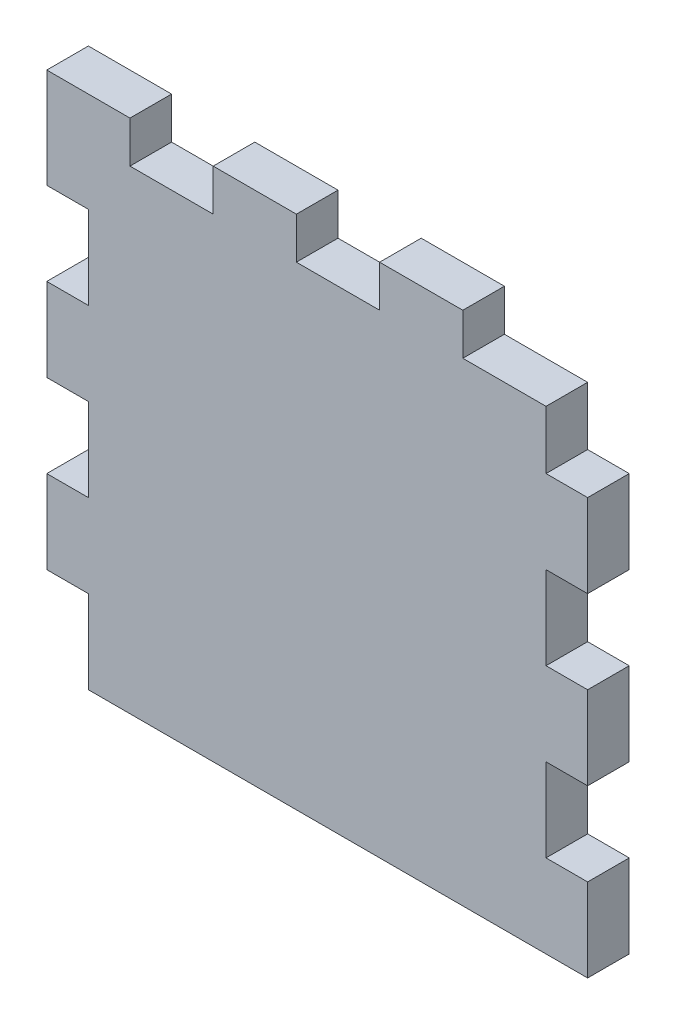
ISO-10303-21;
HEADER;
FILE_DESCRIPTION(('STEP AP214'),'2;1');
FILE_NAME('part.step','',(''),(''),'','','');
FILE_SCHEMA(('AUTOMOTIVE_DESIGN { 1 0 10303 214 1 1 1 1 }'));
ENDSEC;
DATA;
#1=APPLICATION_CONTEXT('core data for automotive mechanical design processes');
#2=APPLICATION_PROTOCOL_DEFINITION('international standard','automotive_design',2000,#1);
#3=PRODUCT_CONTEXT('',#1,'mechanical');
#4=PRODUCT('Part','Part','',(#3));
#5=PRODUCT_RELATED_PRODUCT_CATEGORY('part','',(#4));
#6=PRODUCT_DEFINITION_FORMATION('','',#4);
#7=PRODUCT_DEFINITION_CONTEXT('part definition',#1,'design');
#8=PRODUCT_DEFINITION('design','',#6,#7);
#9=PRODUCT_DEFINITION_SHAPE('','',#8);
#10=(LENGTH_UNIT() NAMED_UNIT(*) SI_UNIT(.MILLI.,.METRE.));
#11=(NAMED_UNIT(*) PLANE_ANGLE_UNIT() SI_UNIT($,.RADIAN.));
#12=(NAMED_UNIT(*) SI_UNIT($,.STERADIAN.) SOLID_ANGLE_UNIT());
#13=UNCERTAINTY_MEASURE_WITH_UNIT(LENGTH_MEASURE(1.E-05),#10,'distance_accuracy_value','');
#14=(GEOMETRIC_REPRESENTATION_CONTEXT(3) GLOBAL_UNCERTAINTY_ASSIGNED_CONTEXT((#13)) GLOBAL_UNIT_ASSIGNED_CONTEXT((#10,
#11,#12)) REPRESENTATION_CONTEXT('',''));
#15=CARTESIAN_POINT('',(0.,0.,0.));
#16=DIRECTION('',(0.,0.,1.));
#17=DIRECTION('',(1.,0.,0.));
#18=AXIS2_PLACEMENT_3D('',#15,#16,#17);
#19=CARTESIAN_POINT('',(-30.,28.5,5.));
#20=DIRECTION('',(1.,0.,0.));
#21=DIRECTION('',(0.,1.,0.));
#22=AXIS2_PLACEMENT_3D('',#19,#20,#21);
#23=PLANE('',#22);
#24=DIRECTION('',(0.,-1.,0.));
#25=VECTOR('',#24,1.);
#26=CARTESIAN_POINT('',(-30.,28.5,5.));
#27=LINE('',#26,#25);
#28=CARTESIAN_POINT('',(-30.,-8.49999999999999,5.));
#29=VERTEX_POINT('',#28);
#30=CARTESIAN_POINT('',(-30.,-18.5,5.));
#31=VERTEX_POINT('',#30);
#32=EDGE_CURVE('E292',#29,#31,#27,.T.);
#33=ORIENTED_EDGE('',*,*,#32,.F.);
#34=DIRECTION('',(0.,0.,-1.));
#35=VECTOR('',#34,1.);
#36=CARTESIAN_POINT('',(-30.,-8.5,5.001));
#37=LINE('',#36,#35);
#38=CARTESIAN_POINT('',(-30.,-8.5,0.));
#39=VERTEX_POINT('',#38);
#40=EDGE_CURVE('E272',#29,#39,#37,.T.);
#41=ORIENTED_EDGE('',*,*,#40,.T.);
#42=DIRECTION('',(0.,-1.,0.));
#43=VECTOR('',#42,1.);
#44=CARTESIAN_POINT('',(-30.,28.5,0.));
#45=LINE('',#44,#43);
#46=CARTESIAN_POINT('',(-30.,-18.5,0.));
#47=VERTEX_POINT('',#46);
#48=EDGE_CURVE('E312',#39,#47,#45,.T.);
#49=ORIENTED_EDGE('',*,*,#48,.T.);
#50=DIRECTION('',(0.,0.,-1.));
#51=VECTOR('',#50,1.);
#52=CARTESIAN_POINT('',(-30.,-18.5,5.001));
#53=LINE('',#52,#51);
#54=EDGE_CURVE('E610',#31,#47,#53,.T.);
#55=ORIENTED_EDGE('',*,*,#54,.F.);
#56=EDGE_LOOP('',(#33,#41,#49,#55));
#57=FACE_BOUND('',#56,.T.);
#58=ADVANCED_FACE('F41',(#57),#23,.F.);
#59=CARTESIAN_POINT('',(-30.,11.5,0.));
#60=VERTEX_POINT('',#59);
#61=CARTESIAN_POINT('',(-30.,1.5,0.));
#62=VERTEX_POINT('',#61);
#63=EDGE_CURVE('E281',#60,#62,#45,.T.);
#64=ORIENTED_EDGE('',*,*,#63,.T.);
#65=DIRECTION('',(0.,0.,-1.));
#66=VECTOR('',#65,1.);
#67=CARTESIAN_POINT('',(-30.,1.5,5.001));
#68=LINE('',#67,#66);
#69=CARTESIAN_POINT('',(-30.,1.5,5.));
#70=VERTEX_POINT('',#69);
#71=EDGE_CURVE('E57',#70,#62,#68,.T.);
#72=ORIENTED_EDGE('',*,*,#71,.F.);
#73=CARTESIAN_POINT('',(-30.,11.5,5.));
#74=VERTEX_POINT('',#73);
#75=EDGE_CURVE('E279',#74,#70,#27,.T.);
#76=ORIENTED_EDGE('',*,*,#75,.F.);
#77=DIRECTION('',(0.,0.,-1.));
#78=VECTOR('',#77,1.);
#79=CARTESIAN_POINT('',(-30.,11.5,5.001));
#80=LINE('',#79,#78);
#81=EDGE_CURVE('E635',#74,#60,#80,.T.);
#82=ORIENTED_EDGE('',*,*,#81,.T.);
#83=EDGE_LOOP('',(#64,#72,#76,#82));
#84=FACE_BOUND('',#83,.T.);
#85=ADVANCED_FACE('F277',(#84),#23,.F.);
#86=CARTESIAN_POINT('',(-30.,28.5,5.));
#87=DIRECTION('',(0.,-1.,0.));
#88=DIRECTION('',(0.,0.,-1.));
#89=AXIS2_PLACEMENT_3D('',#86,#87,#88);
#90=PLANE('',#89);
#91=DIRECTION('',(-1.,0.,0.));
#92=VECTOR('',#91,1.);
#93=CARTESIAN_POINT('',(-30.,28.5,0.));
#94=LINE('',#93,#92);
#95=CARTESIAN_POINT('',(30.,28.5,0.));
#96=VERTEX_POINT('',#95);
#97=CARTESIAN_POINT('',(20.,28.5,0.));
#98=VERTEX_POINT('',#97);
#99=EDGE_CURVE('E309',#96,#98,#94,.T.);
#100=ORIENTED_EDGE('',*,*,#99,.T.);
#101=DIRECTION('',(0.,0.,-1.));
#102=VECTOR('',#101,1.);
#103=CARTESIAN_POINT('',(20.,28.5,16.180339887499));
#104=LINE('',#103,#102);
#105=CARTESIAN_POINT('',(20.,28.5,5.));
#106=VERTEX_POINT('',#105);
#107=EDGE_CURVE('E355',#106,#98,#104,.T.);
#108=ORIENTED_EDGE('',*,*,#107,.F.);
#109=DIRECTION('',(-1.,0.,0.));
#110=VECTOR('',#109,1.);
#111=CARTESIAN_POINT('',(-30.,28.5,5.));
#112=LINE('',#111,#110);
#113=CARTESIAN_POINT('',(30.,28.5,5.));
#114=VERTEX_POINT('',#113);
#115=EDGE_CURVE('E297',#114,#106,#112,.T.);
#116=ORIENTED_EDGE('',*,*,#115,.F.);
#117=DIRECTION('',(0.,0.,-1.));
#118=VECTOR('',#117,1.);
#119=CARTESIAN_POINT('',(30.,28.5,5.));
#120=LINE('',#119,#118);
#121=EDGE_CURVE('E11',#114,#96,#120,.T.);
#122=ORIENTED_EDGE('',*,*,#121,.T.);
#123=EDGE_LOOP('',(#100,#108,#116,#122));
#124=FACE_BOUND('',#123,.T.);
#125=ADVANCED_FACE('F584',(#124),#90,.F.);
#126=CARTESIAN_POINT('',(10.,28.5,5.));
#127=VERTEX_POINT('',#126);
#128=CARTESIAN_POINT('',(0.,28.5,5.));
#129=VERTEX_POINT('',#128);
#130=EDGE_CURVE('E341',#127,#129,#112,.T.);
#131=ORIENTED_EDGE('',*,*,#130,.F.);
#132=DIRECTION('',(0.,0.,-1.));
#133=VECTOR('',#132,1.);
#134=CARTESIAN_POINT('',(10.,28.5,16.180339887499));
#135=LINE('',#134,#133);
#136=CARTESIAN_POINT('',(10.,28.5,0.));
#137=VERTEX_POINT('',#136);
#138=EDGE_CURVE('E363',#127,#137,#135,.T.);
#139=ORIENTED_EDGE('',*,*,#138,.T.);
#140=CARTESIAN_POINT('',(0.,28.5,0.));
#141=VERTEX_POINT('',#140);
#142=EDGE_CURVE('E313',#137,#141,#94,.T.);
#143=ORIENTED_EDGE('',*,*,#142,.T.);
#144=DIRECTION('',(0.,0.,-1.));
#145=VECTOR('',#144,1.);
#146=CARTESIAN_POINT('',(0.,28.5,16.180339887499));
#147=LINE('',#146,#145);
#148=EDGE_CURVE('E404',#129,#141,#147,.T.);
#149=ORIENTED_EDGE('',*,*,#148,.F.);
#150=EDGE_LOOP('',(#131,#139,#143,#149));
#151=FACE_BOUND('',#150,.T.);
#152=ADVANCED_FACE('F724',(#151),#90,.F.);
#153=CARTESIAN_POINT('',(-10.,28.5,5.));
#154=VERTEX_POINT('',#153);
#155=CARTESIAN_POINT('',(-20.,28.5,5.));
#156=VERTEX_POINT('',#155);
#157=EDGE_CURVE('E336',#154,#156,#112,.T.);
#158=ORIENTED_EDGE('',*,*,#157,.F.);
#159=DIRECTION('',(0.,0.,-1.));
#160=VECTOR('',#159,1.);
#161=CARTESIAN_POINT('',(-10.,28.5,16.180339887499));
#162=LINE('',#161,#160);
#163=CARTESIAN_POINT('',(-10.,28.5,0.));
#164=VERTEX_POINT('',#163);
#165=EDGE_CURVE('E399',#154,#164,#162,.T.);
#166=ORIENTED_EDGE('',*,*,#165,.T.);
#167=CARTESIAN_POINT('',(-20.,28.5,0.));
#168=VERTEX_POINT('',#167);
#169=EDGE_CURVE('E306',#164,#168,#94,.T.);
#170=ORIENTED_EDGE('',*,*,#169,.T.);
#171=DIRECTION('',(0.,0.,-1.));
#172=VECTOR('',#171,1.);
#173=CARTESIAN_POINT('',(-20.,28.5,16.180339887499));
#174=LINE('',#173,#172);
#175=EDGE_CURVE('E432',#156,#168,#174,.T.);
#176=ORIENTED_EDGE('',*,*,#175,.F.);
#177=EDGE_LOOP('',(#158,#166,#170,#176));
#178=FACE_BOUND('',#177,.T.);
#179=ADVANCED_FACE('F698',(#178),#90,.F.);
#180=CARTESIAN_POINT('',(30.,28.5,5.));
#181=DIRECTION('',(-1.,0.,0.));
#182=DIRECTION('',(0.,-1.,0.));
#183=AXIS2_PLACEMENT_3D('',#180,#181,#182);
#184=PLANE('',#183);
#185=DIRECTION('',(0.,1.,0.));
#186=VECTOR('',#185,1.);
#187=CARTESIAN_POINT('',(30.,28.5,5.));
#188=LINE('',#187,#186);
#189=CARTESIAN_POINT('',(30.,21.5,5.));
#190=VERTEX_POINT('',#189);
#191=EDGE_CURVE('E319',#190,#114,#188,.T.);
#192=ORIENTED_EDGE('',*,*,#191,.F.);
#193=DIRECTION('',(0.,0.,1.));
#194=VECTOR('',#193,1.);
#195=CARTESIAN_POINT('',(30.,21.5,-11.1803398874989));
#196=LINE('',#195,#194);
#197=CARTESIAN_POINT('',(30.,21.5,0.));
#198=VERTEX_POINT('',#197);
#199=EDGE_CURVE('E447',#198,#190,#196,.T.);
#200=ORIENTED_EDGE('',*,*,#199,.F.);
#201=DIRECTION('',(0.,1.,0.));
#202=VECTOR('',#201,1.);
#203=CARTESIAN_POINT('',(30.,28.5,0.));
#204=LINE('',#203,#202);
#205=EDGE_CURVE('E308',#198,#96,#204,.T.);
#206=ORIENTED_EDGE('',*,*,#205,.T.);
#207=ORIENTED_EDGE('',*,*,#121,.F.);
#208=EDGE_LOOP('',(#192,#200,#206,#207));
#209=FACE_BOUND('',#208,.T.);
#210=ADVANCED_FACE('F582',(#209),#184,.F.);
#211=CARTESIAN_POINT('',(30.,1.5,0.));
#212=VERTEX_POINT('',#211);
#213=CARTESIAN_POINT('',(30.,11.5,0.));
#214=VERTEX_POINT('',#213);
#215=EDGE_CURVE('E307',#212,#214,#204,.T.);
#216=ORIENTED_EDGE('',*,*,#215,.T.);
#217=DIRECTION('',(0.,0.,1.));
#218=VECTOR('',#217,1.);
#219=CARTESIAN_POINT('',(30.,11.5,-11.1803398874989));
#220=LINE('',#219,#218);
#221=CARTESIAN_POINT('',(30.,11.5,5.));
#222=VERTEX_POINT('',#221);
#223=EDGE_CURVE('E461',#214,#222,#220,.T.);
#224=ORIENTED_EDGE('',*,*,#223,.T.);
#225=CARTESIAN_POINT('',(30.,1.5,5.));
#226=VERTEX_POINT('',#225);
#227=EDGE_CURVE('E326',#226,#222,#188,.T.);
#228=ORIENTED_EDGE('',*,*,#227,.F.);
#229=DIRECTION('',(0.,0.,1.));
#230=VECTOR('',#229,1.);
#231=CARTESIAN_POINT('',(30.,1.5,-11.1803398874989));
#232=LINE('',#231,#230);
#233=EDGE_CURVE('E481',#212,#226,#232,.T.);
#234=ORIENTED_EDGE('',*,*,#233,.F.);
#235=EDGE_LOOP('',(#216,#224,#228,#234));
#236=FACE_BOUND('',#235,.T.);
#237=ADVANCED_FACE('F564',(#236),#184,.F.);
#238=CARTESIAN_POINT('',(30.,-18.5,0.));
#239=VERTEX_POINT('',#238);
#240=CARTESIAN_POINT('',(30.,-8.49999999999999,0.));
#241=VERTEX_POINT('',#240);
#242=EDGE_CURVE('E303',#239,#241,#204,.T.);
#243=ORIENTED_EDGE('',*,*,#242,.T.);
#244=DIRECTION('',(0.,0.,1.));
#245=VECTOR('',#244,1.);
#246=CARTESIAN_POINT('',(30.,-8.5,-11.1803398874989));
#247=LINE('',#246,#245);
#248=CARTESIAN_POINT('',(30.,-8.49999999999999,5.));
#249=VERTEX_POINT('',#248);
#250=EDGE_CURVE('E495',#241,#249,#247,.T.);
#251=ORIENTED_EDGE('',*,*,#250,.T.);
#252=CARTESIAN_POINT('',(30.,-18.5,5.));
#253=VERTEX_POINT('',#252);
#254=EDGE_CURVE('E327',#253,#249,#188,.T.);
#255=ORIENTED_EDGE('',*,*,#254,.F.);
#256=DIRECTION('',(0.,0.,1.));
#257=VECTOR('',#256,1.);
#258=CARTESIAN_POINT('',(30.,-18.5,-11.1803398874989));
#259=LINE('',#258,#257);
#260=EDGE_CURVE('E515',#239,#253,#259,.T.);
#261=ORIENTED_EDGE('',*,*,#260,.F.);
#262=EDGE_LOOP('',(#243,#251,#255,#261));
#263=FACE_BOUND('',#262,.T.);
#264=ADVANCED_FACE('F43',(#263),#184,.F.);
#265=CARTESIAN_POINT('',(-30.,33.5,0.));
#266=VERTEX_POINT('',#265);
#267=CARTESIAN_POINT('',(-30.,21.5,0.));
#268=VERTEX_POINT('',#267);
#269=EDGE_CURVE('E314',#266,#268,#45,.T.);
#270=ORIENTED_EDGE('',*,*,#269,.T.);
#271=DIRECTION('',(0.,0.,-1.));
#272=VECTOR('',#271,1.);
#273=CARTESIAN_POINT('',(-30.,21.5,5.001));
#274=LINE('',#273,#272);
#275=CARTESIAN_POINT('',(-30.,21.5,5.));
#276=VERTEX_POINT('',#275);
#277=EDGE_CURVE('E65',#276,#268,#274,.T.);
#278=ORIENTED_EDGE('',*,*,#277,.F.);
#279=CARTESIAN_POINT('',(-30.,33.5,5.));
#280=VERTEX_POINT('',#279);
#281=EDGE_CURVE('E291',#280,#276,#27,.T.);
#282=ORIENTED_EDGE('',*,*,#281,.F.);
#283=DIRECTION('',(0.,0.,-1.));
#284=VECTOR('',#283,1.);
#285=CARTESIAN_POINT('',(-30.,33.5,16.180339887499));
#286=LINE('',#285,#284);
#287=EDGE_CURVE('E436',#280,#266,#286,.T.);
#288=ORIENTED_EDGE('',*,*,#287,.T.);
#289=EDGE_LOOP('',(#270,#278,#282,#288));
#290=FACE_BOUND('',#289,.T.);
#291=ADVANCED_FACE('F711',(#290),#23,.F.);
#292=CARTESIAN_POINT('',(-30.,-28.5,5.));
#293=DIRECTION('',(0.,1.,0.));
#294=DIRECTION('',(0.,0.,1.));
#295=AXIS2_PLACEMENT_3D('',#292,#293,#294);
#296=PLANE('',#295);
#297=DIRECTION('',(1.,0.,0.));
#298=VECTOR('',#297,1.);
#299=CARTESIAN_POINT('',(-30.,-28.5,5.));
#300=LINE('',#299,#298);
#301=CARTESIAN_POINT('',(-25.,-28.5,5.));
#302=VERTEX_POINT('',#301);
#303=CARTESIAN_POINT('',(35.,-28.5,5.));
#304=VERTEX_POINT('',#303);
#305=EDGE_CURVE('E50',#302,#304,#300,.T.);
#306=ORIENTED_EDGE('',*,*,#305,.F.);
#307=DIRECTION('',(0.,0.,-1.));
#308=VECTOR('',#307,1.);
#309=CARTESIAN_POINT('',(-25.,-28.5,5.001));
#310=LINE('',#309,#308);
#311=CARTESIAN_POINT('',(-25.,-28.5,0.));
#312=VERTEX_POINT('',#311);
#313=EDGE_CURVE('E604',#302,#312,#310,.T.);
#314=ORIENTED_EDGE('',*,*,#313,.T.);
#315=DIRECTION('',(1.,0.,0.));
#316=VECTOR('',#315,1.);
#317=CARTESIAN_POINT('',(-30.,-28.5,0.));
#318=LINE('',#317,#316);
#319=CARTESIAN_POINT('',(35.,-28.5,0.));
#320=VERTEX_POINT('',#319);
#321=EDGE_CURVE('E317',#312,#320,#318,.T.);
#322=ORIENTED_EDGE('',*,*,#321,.T.);
#323=DIRECTION('',(0.,0.,1.));
#324=VECTOR('',#323,1.);
#325=CARTESIAN_POINT('',(35.,-28.5,-11.1803398874989));
#326=LINE('',#325,#324);
#327=EDGE_CURVE('E524',#320,#304,#326,.T.);
#328=ORIENTED_EDGE('',*,*,#327,.T.);
#329=EDGE_LOOP('',(#306,#314,#322,#328));
#330=FACE_BOUND('',#329,.T.);
#331=ADVANCED_FACE('F534',(#330),#296,.F.);
#332=CARTESIAN_POINT('',(0.,0.,5.));
#333=DIRECTION('',(0.,0.,1.));
#334=DIRECTION('',(1.,0.,0.));
#335=AXIS2_PLACEMENT_3D('',#332,#333,#334);
#336=PLANE('',#335);
#337=DIRECTION('',(-1.,0.,0.));
#338=VECTOR('',#337,1.);
#339=CARTESIAN_POINT('',(-30.,-8.5,5.));
#340=LINE('',#339,#338);
#341=CARTESIAN_POINT('',(-25.,-8.5,5.));
#342=VERTEX_POINT('',#341);
#343=EDGE_CURVE('E678',#342,#29,#340,.T.);
#344=ORIENTED_EDGE('',*,*,#343,.T.);
#345=ORIENTED_EDGE('',*,*,#32,.T.);
#346=DIRECTION('',(1.,0.,0.));
#347=VECTOR('',#346,1.);
#348=CARTESIAN_POINT('',(-30.,-18.5,5.));
#349=LINE('',#348,#347);
#350=CARTESIAN_POINT('',(-25.,-18.5,5.));
#351=VERTEX_POINT('',#350);
#352=EDGE_CURVE('E597',#31,#351,#349,.T.);
#353=ORIENTED_EDGE('',*,*,#352,.T.);
#354=DIRECTION('',(0.,-1.,0.));
#355=VECTOR('',#354,1.);
#356=CARTESIAN_POINT('',(-25.,-28.5,5.));
#357=LINE('',#356,#355);
#358=EDGE_CURVE('E271',#351,#302,#357,.T.);
#359=ORIENTED_EDGE('',*,*,#358,.T.);
#360=ORIENTED_EDGE('',*,*,#305,.T.);
#361=DIRECTION('',(0.,1.,0.));
#362=VECTOR('',#361,1.);
#363=CARTESIAN_POINT('',(35.,-18.5,5.));
#364=LINE('',#363,#362);
#365=CARTESIAN_POINT('',(35.,-18.5,5.));
#366=VERTEX_POINT('',#365);
#367=EDGE_CURVE('E510',#304,#366,#364,.T.);
#368=ORIENTED_EDGE('',*,*,#367,.T.);
#369=DIRECTION('',(-1.,0.,0.));
#370=VECTOR('',#369,1.);
#371=CARTESIAN_POINT('',(30.,-18.5,5.));
#372=LINE('',#371,#370);
#373=EDGE_CURVE('E521',#366,#253,#372,.T.);
#374=ORIENTED_EDGE('',*,*,#373,.T.);
#375=ORIENTED_EDGE('',*,*,#254,.T.);
#376=DIRECTION('',(1.,0.,0.));
#377=VECTOR('',#376,1.);
#378=CARTESIAN_POINT('',(30.,-8.5,5.));
#379=LINE('',#378,#377);
#380=CARTESIAN_POINT('',(35.,-8.5,5.));
#381=VERTEX_POINT('',#380);
#382=EDGE_CURVE('E476',#249,#381,#379,.T.);
#383=ORIENTED_EDGE('',*,*,#382,.T.);
#384=DIRECTION('',(0.,1.,0.));
#385=VECTOR('',#384,1.);
#386=CARTESIAN_POINT('',(35.,1.5,5.));
#387=LINE('',#386,#385);
#388=CARTESIAN_POINT('',(35.,1.5,5.));
#389=VERTEX_POINT('',#388);
#390=EDGE_CURVE('E487',#381,#389,#387,.T.);
#391=ORIENTED_EDGE('',*,*,#390,.T.);
#392=DIRECTION('',(-1.,0.,0.));
#393=VECTOR('',#392,1.);
#394=CARTESIAN_POINT('',(30.,1.5,5.));
#395=LINE('',#394,#393);
#396=EDGE_CURVE('E491',#389,#226,#395,.T.);
#397=ORIENTED_EDGE('',*,*,#396,.T.);
#398=ORIENTED_EDGE('',*,*,#227,.T.);
#399=DIRECTION('',(1.,0.,0.));
#400=VECTOR('',#399,1.);
#401=CARTESIAN_POINT('',(30.,11.5,5.));
#402=LINE('',#401,#400);
#403=CARTESIAN_POINT('',(35.,11.5,5.));
#404=VERTEX_POINT('',#403);
#405=EDGE_CURVE('E442',#222,#404,#402,.T.);
#406=ORIENTED_EDGE('',*,*,#405,.T.);
#407=DIRECTION('',(0.,1.,0.));
#408=VECTOR('',#407,1.);
#409=CARTESIAN_POINT('',(35.,21.5,5.));
#410=LINE('',#409,#408);
#411=CARTESIAN_POINT('',(35.,21.5,5.));
#412=VERTEX_POINT('',#411);
#413=EDGE_CURVE('E454',#404,#412,#410,.T.);
#414=ORIENTED_EDGE('',*,*,#413,.T.);
#415=DIRECTION('',(-1.,0.,0.));
#416=VECTOR('',#415,1.);
#417=CARTESIAN_POINT('',(30.,21.5,5.));
#418=LINE('',#417,#416);
#419=EDGE_CURVE('E458',#412,#190,#418,.T.);
#420=ORIENTED_EDGE('',*,*,#419,.T.);
#421=ORIENTED_EDGE('',*,*,#191,.T.);
#422=ORIENTED_EDGE('',*,*,#115,.T.);
#423=DIRECTION('',(0.,-1.,0.));
#424=VECTOR('',#423,1.);
#425=CARTESIAN_POINT('',(20.,28.5,5.));
#426=LINE('',#425,#424);
#427=CARTESIAN_POINT('',(20.,33.5,5.));
#428=VERTEX_POINT('',#427);
#429=EDGE_CURVE('E347',#428,#106,#426,.T.);
#430=ORIENTED_EDGE('',*,*,#429,.F.);
#431=DIRECTION('',(1.,0.,0.));
#432=VECTOR('',#431,1.);
#433=CARTESIAN_POINT('',(10.,33.5,5.));
#434=LINE('',#433,#432);
#435=CARTESIAN_POINT('',(10.,33.5,5.));
#436=VERTEX_POINT('',#435);
#437=EDGE_CURVE('E365',#436,#428,#434,.T.);
#438=ORIENTED_EDGE('',*,*,#437,.F.);
#439=DIRECTION('',(0.,1.,0.));
#440=VECTOR('',#439,1.);
#441=CARTESIAN_POINT('',(10.,28.5,5.));
#442=LINE('',#441,#440);
#443=EDGE_CURVE('E369',#127,#436,#442,.T.);
#444=ORIENTED_EDGE('',*,*,#443,.F.);
#445=ORIENTED_EDGE('',*,*,#130,.T.);
#446=DIRECTION('',(0.,-1.,0.));
#447=VECTOR('',#446,1.);
#448=CARTESIAN_POINT('',(0.,28.5,5.));
#449=LINE('',#448,#447);
#450=CARTESIAN_POINT('',(0.,33.5,5.));
#451=VERTEX_POINT('',#450);
#452=EDGE_CURVE('E400',#451,#129,#449,.T.);
#453=ORIENTED_EDGE('',*,*,#452,.F.);
#454=DIRECTION('',(1.,0.,0.));
#455=VECTOR('',#454,1.);
#456=CARTESIAN_POINT('',(-10.,33.5,5.));
#457=LINE('',#456,#455);
#458=CARTESIAN_POINT('',(-10.,33.5,5.));
#459=VERTEX_POINT('',#458);
#460=EDGE_CURVE('E382',#459,#451,#457,.T.);
#461=ORIENTED_EDGE('',*,*,#460,.F.);
#462=DIRECTION('',(0.,1.,0.));
#463=VECTOR('',#462,1.);
#464=CARTESIAN_POINT('',(-10.,28.5,5.));
#465=LINE('',#464,#463);
#466=EDGE_CURVE('E394',#154,#459,#465,.T.);
#467=ORIENTED_EDGE('',*,*,#466,.F.);
#468=ORIENTED_EDGE('',*,*,#157,.T.);
#469=DIRECTION('',(0.,-1.,0.));
#470=VECTOR('',#469,1.);
#471=CARTESIAN_POINT('',(-20.,28.5,5.));
#472=LINE('',#471,#470);
#473=CARTESIAN_POINT('',(-20.,33.5,5.));
#474=VERTEX_POINT('',#473);
#475=EDGE_CURVE('E428',#474,#156,#472,.T.);
#476=ORIENTED_EDGE('',*,*,#475,.F.);
#477=DIRECTION('',(1.,0.,0.));
#478=VECTOR('',#477,1.);
#479=CARTESIAN_POINT('',(-30.,33.5,5.));
#480=LINE('',#479,#478);
#481=EDGE_CURVE('E420',#280,#474,#480,.T.);
#482=ORIENTED_EDGE('',*,*,#481,.F.);
#483=ORIENTED_EDGE('',*,*,#281,.T.);
#484=DIRECTION('',(1.,0.,0.));
#485=VECTOR('',#484,1.);
#486=CARTESIAN_POINT('',(-30.,21.5,5.));
#487=LINE('',#486,#485);
#488=CARTESIAN_POINT('',(-25.,21.5,5.));
#489=VERTEX_POINT('',#488);
#490=EDGE_CURVE('E630',#276,#489,#487,.T.);
#491=ORIENTED_EDGE('',*,*,#490,.T.);
#492=DIRECTION('',(0.,-1.,0.));
#493=VECTOR('',#492,1.);
#494=CARTESIAN_POINT('',(-25.,11.5,5.));
#495=LINE('',#494,#493);
#496=CARTESIAN_POINT('',(-25.,11.5,5.));
#497=VERTEX_POINT('',#496);
#498=EDGE_CURVE('E658',#489,#497,#495,.T.);
#499=ORIENTED_EDGE('',*,*,#498,.T.);
#500=DIRECTION('',(-1.,0.,0.));
#501=VECTOR('',#500,1.);
#502=CARTESIAN_POINT('',(-30.,11.5,5.));
#503=LINE('',#502,#501);
#504=EDGE_CURVE('E289',#497,#74,#503,.T.);
#505=ORIENTED_EDGE('',*,*,#504,.T.);
#506=ORIENTED_EDGE('',*,*,#75,.T.);
#507=DIRECTION('',(1.,0.,0.));
#508=VECTOR('',#507,1.);
#509=CARTESIAN_POINT('',(-30.,1.5,5.));
#510=LINE('',#509,#508);
#511=CARTESIAN_POINT('',(-25.,1.5,5.));
#512=VERTEX_POINT('',#511);
#513=EDGE_CURVE('E264',#70,#512,#510,.T.);
#514=ORIENTED_EDGE('',*,*,#513,.T.);
#515=DIRECTION('',(0.,-1.,0.));
#516=VECTOR('',#515,1.);
#517=CARTESIAN_POINT('',(-25.,-8.5,5.));
#518=LINE('',#517,#516);
#519=EDGE_CURVE('E634',#512,#342,#518,.T.);
#520=ORIENTED_EDGE('',*,*,#519,.T.);
#521=EDGE_LOOP('',(#344,#345,#353,#359,#360,#368,#374,#375,#383,#391,#397,#398,#406,#414,#420,
#421,#422,#430,#438,#444,#445,#453,#461,#467,#468,#476,#482,#483,#491,#499,#505,#506,#514,#520));
#522=FACE_BOUND('',#521,.T.);
#523=ADVANCED_FACE('F287',(#522),#336,.T.);
#524=CARTESIAN_POINT('',(0.,0.,0.));
#525=DIRECTION('',(0.,0.,1.));
#526=DIRECTION('',(1.,0.,0.));
#527=AXIS2_PLACEMENT_3D('',#524,#525,#526);
#528=PLANE('',#527);
#529=ORIENTED_EDGE('',*,*,#48,.F.);
#530=DIRECTION('',(-1.,0.,0.));
#531=VECTOR('',#530,1.);
#532=CARTESIAN_POINT('',(-30.,-8.5,0.));
#533=LINE('',#532,#531);
#534=CARTESIAN_POINT('',(-25.,-8.5,0.));
#535=VERTEX_POINT('',#534);
#536=EDGE_CURVE('E283',#535,#39,#533,.T.);
#537=ORIENTED_EDGE('',*,*,#536,.F.);
#538=DIRECTION('',(0.,-1.,0.));
#539=VECTOR('',#538,1.);
#540=CARTESIAN_POINT('',(-25.,-8.5,0.));
#541=LINE('',#540,#539);
#542=CARTESIAN_POINT('',(-25.,1.5,0.));
#543=VERTEX_POINT('',#542);
#544=EDGE_CURVE('E671',#543,#535,#541,.T.);
#545=ORIENTED_EDGE('',*,*,#544,.F.);
#546=DIRECTION('',(1.,0.,0.));
#547=VECTOR('',#546,1.);
#548=CARTESIAN_POINT('',(-30.,1.5,0.));
#549=LINE('',#548,#547);
#550=EDGE_CURVE('E675',#62,#543,#549,.T.);
#551=ORIENTED_EDGE('',*,*,#550,.F.);
#552=ORIENTED_EDGE('',*,*,#63,.F.);
#553=DIRECTION('',(-1.,0.,0.));
#554=VECTOR('',#553,1.);
#555=CARTESIAN_POINT('',(-30.,11.5,0.));
#556=LINE('',#555,#554);
#557=CARTESIAN_POINT('',(-25.,11.5,0.));
#558=VERTEX_POINT('',#557);
#559=EDGE_CURVE('E639',#558,#60,#556,.T.);
#560=ORIENTED_EDGE('',*,*,#559,.F.);
#561=DIRECTION('',(0.,-1.,0.));
#562=VECTOR('',#561,1.);
#563=CARTESIAN_POINT('',(-25.,11.5,0.));
#564=LINE('',#563,#562);
#565=CARTESIAN_POINT('',(-25.,21.5,0.));
#566=VERTEX_POINT('',#565);
#567=EDGE_CURVE('E649',#566,#558,#564,.T.);
#568=ORIENTED_EDGE('',*,*,#567,.F.);
#569=DIRECTION('',(1.,0.,0.));
#570=VECTOR('',#569,1.);
#571=CARTESIAN_POINT('',(-30.,21.5,0.));
#572=LINE('',#571,#570);
#573=EDGE_CURVE('E653',#268,#566,#572,.T.);
#574=ORIENTED_EDGE('',*,*,#573,.F.);
#575=ORIENTED_EDGE('',*,*,#269,.F.);
#576=DIRECTION('',(1.,0.,0.));
#577=VECTOR('',#576,1.);
#578=CARTESIAN_POINT('',(-30.,33.5,0.));
#579=LINE('',#578,#577);
#580=CARTESIAN_POINT('',(-20.,33.5,0.));
#581=VERTEX_POINT('',#580);
#582=EDGE_CURVE('E415',#266,#581,#579,.T.);
#583=ORIENTED_EDGE('',*,*,#582,.T.);
#584=DIRECTION('',(0.,-1.,0.));
#585=VECTOR('',#584,1.);
#586=CARTESIAN_POINT('',(-20.,28.5,0.));
#587=LINE('',#586,#585);
#588=EDGE_CURVE('E416',#581,#168,#587,.T.);
#589=ORIENTED_EDGE('',*,*,#588,.T.);
#590=ORIENTED_EDGE('',*,*,#169,.F.);
#591=DIRECTION('',(0.,1.,0.));
#592=VECTOR('',#591,1.);
#593=CARTESIAN_POINT('',(-10.,28.5,0.));
#594=LINE('',#593,#592);
#595=CARTESIAN_POINT('',(-10.,33.5,0.));
#596=VERTEX_POINT('',#595);
#597=EDGE_CURVE('E377',#164,#596,#594,.T.);
#598=ORIENTED_EDGE('',*,*,#597,.T.);
#599=DIRECTION('',(1.,0.,0.));
#600=VECTOR('',#599,1.);
#601=CARTESIAN_POINT('',(-10.,33.5,0.));
#602=LINE('',#601,#600);
#603=CARTESIAN_POINT('',(0.,33.5,0.));
#604=VERTEX_POINT('',#603);
#605=EDGE_CURVE('E383',#596,#604,#602,.T.);
#606=ORIENTED_EDGE('',*,*,#605,.T.);
#607=DIRECTION('',(0.,-1.,0.));
#608=VECTOR('',#607,1.);
#609=CARTESIAN_POINT('',(0.,28.5,0.));
#610=LINE('',#609,#608);
#611=EDGE_CURVE('E378',#604,#141,#610,.T.);
#612=ORIENTED_EDGE('',*,*,#611,.T.);
#613=ORIENTED_EDGE('',*,*,#142,.F.);
#614=DIRECTION('',(0.,1.,0.));
#615=VECTOR('',#614,1.);
#616=CARTESIAN_POINT('',(10.,28.5,0.));
#617=LINE('',#616,#615);
#618=CARTESIAN_POINT('',(10.,33.5,0.));
#619=VERTEX_POINT('',#618);
#620=EDGE_CURVE('E594',#137,#619,#617,.T.);
#621=ORIENTED_EDGE('',*,*,#620,.T.);
#622=DIRECTION('',(1.,0.,0.));
#623=VECTOR('',#622,1.);
#624=CARTESIAN_POINT('',(10.,33.5,0.));
#625=LINE('',#624,#623);
#626=CARTESIAN_POINT('',(20.,33.5,0.));
#627=VERTEX_POINT('',#626);
#628=EDGE_CURVE('E589',#619,#627,#625,.T.);
#629=ORIENTED_EDGE('',*,*,#628,.T.);
#630=DIRECTION('',(0.,-1.,0.));
#631=VECTOR('',#630,1.);
#632=CARTESIAN_POINT('',(20.,28.5,0.));
#633=LINE('',#632,#631);
#634=EDGE_CURVE('E586',#627,#98,#633,.T.);
#635=ORIENTED_EDGE('',*,*,#634,.T.);
#636=ORIENTED_EDGE('',*,*,#99,.F.);
#637=ORIENTED_EDGE('',*,*,#205,.F.);
#638=DIRECTION('',(1.,0.,0.));
#639=VECTOR('',#638,1.);
#640=CARTESIAN_POINT('',(30.,21.5,0.));
#641=LINE('',#640,#639);
#642=CARTESIAN_POINT('',(35.,21.5,0.));
#643=VERTEX_POINT('',#642);
#644=EDGE_CURVE('E446',#198,#643,#641,.T.);
#645=ORIENTED_EDGE('',*,*,#644,.T.);
#646=DIRECTION('',(0.,-1.,0.));
#647=VECTOR('',#646,1.);
#648=CARTESIAN_POINT('',(35.,21.5,0.));
#649=LINE('',#648,#647);
#650=CARTESIAN_POINT('',(35.,11.5,0.));
#651=VERTEX_POINT('',#650);
#652=EDGE_CURVE('E443',#643,#651,#649,.T.);
#653=ORIENTED_EDGE('',*,*,#652,.T.);
#654=DIRECTION('',(-1.,0.,0.));
#655=VECTOR('',#654,1.);
#656=CARTESIAN_POINT('',(30.,11.5,0.));
#657=LINE('',#656,#655);
#658=EDGE_CURVE('E450',#651,#214,#657,.T.);
#659=ORIENTED_EDGE('',*,*,#658,.T.);
#660=ORIENTED_EDGE('',*,*,#215,.F.);
#661=DIRECTION('',(1.,0.,0.));
#662=VECTOR('',#661,1.);
#663=CARTESIAN_POINT('',(30.,1.5,0.));
#664=LINE('',#663,#662);
#665=CARTESIAN_POINT('',(35.,1.5,0.));
#666=VERTEX_POINT('',#665);
#667=EDGE_CURVE('E480',#212,#666,#664,.T.);
#668=ORIENTED_EDGE('',*,*,#667,.T.);
#669=DIRECTION('',(0.,-1.,0.));
#670=VECTOR('',#669,1.);
#671=CARTESIAN_POINT('',(35.,1.5,0.));
#672=LINE('',#671,#670);
#673=CARTESIAN_POINT('',(35.,-8.5,0.));
#674=VERTEX_POINT('',#673);
#675=EDGE_CURVE('E477',#666,#674,#672,.T.);
#676=ORIENTED_EDGE('',*,*,#675,.T.);
#677=DIRECTION('',(-1.,0.,0.));
#678=VECTOR('',#677,1.);
#679=CARTESIAN_POINT('',(30.,-8.5,0.));
#680=LINE('',#679,#678);
#681=EDGE_CURVE('E484',#674,#241,#680,.T.);
#682=ORIENTED_EDGE('',*,*,#681,.T.);
#683=ORIENTED_EDGE('',*,*,#242,.F.);
#684=DIRECTION('',(1.,0.,0.));
#685=VECTOR('',#684,1.);
#686=CARTESIAN_POINT('',(30.,-18.5,0.));
#687=LINE('',#686,#685);
#688=CARTESIAN_POINT('',(35.,-18.5,0.));
#689=VERTEX_POINT('',#688);
#690=EDGE_CURVE('E514',#239,#689,#687,.T.);
#691=ORIENTED_EDGE('',*,*,#690,.T.);
#692=DIRECTION('',(0.,-1.,0.));
#693=VECTOR('',#692,1.);
#694=CARTESIAN_POINT('',(35.,-18.5,0.));
#695=LINE('',#694,#693);
#696=EDGE_CURVE('E511',#689,#320,#695,.T.);
#697=ORIENTED_EDGE('',*,*,#696,.T.);
#698=ORIENTED_EDGE('',*,*,#321,.F.);
#699=DIRECTION('',(0.,-1.,0.));
#700=VECTOR('',#699,1.);
#701=CARTESIAN_POINT('',(-25.,-28.5,0.));
#702=LINE('',#701,#700);
#703=CARTESIAN_POINT('',(-25.,-18.5,0.));
#704=VERTEX_POINT('',#703);
#705=EDGE_CURVE('E613',#704,#312,#702,.T.);
#706=ORIENTED_EDGE('',*,*,#705,.F.);
#707=DIRECTION('',(1.,0.,0.));
#708=VECTOR('',#707,1.);
#709=CARTESIAN_POINT('',(-30.,-18.5,0.));
#710=LINE('',#709,#708);
#711=EDGE_CURVE('E622',#47,#704,#710,.T.);
#712=ORIENTED_EDGE('',*,*,#711,.F.);
#713=EDGE_LOOP('',(#529,#537,#545,#551,#552,#560,#568,#574,#575,#583,#589,#590,#598,#606,#612,
#613,#621,#629,#635,#636,#637,#645,#653,#659,#660,#668,#676,#682,#683,#691,#697,#698,#706,#712));
#714=FACE_BOUND('',#713,.T.);
#715=ADVANCED_FACE('F548',(#714),#528,.F.);
#716=CARTESIAN_POINT('',(30.,-18.5,-11.1803398874989));
#717=DIRECTION('',(0.,1.,0.));
#718=DIRECTION('',(0.,0.,1.));
#719=AXIS2_PLACEMENT_3D('',#716,#717,#718);
#720=PLANE('',#719);
#721=ORIENTED_EDGE('',*,*,#690,.F.);
#722=ORIENTED_EDGE('',*,*,#260,.T.);
#723=ORIENTED_EDGE('',*,*,#373,.F.);
#724=DIRECTION('',(0.,0.,1.));
#725=VECTOR('',#724,1.);
#726=CARTESIAN_POINT('',(35.,-18.5,-11.1803398874989));
#727=LINE('',#726,#725);
#728=EDGE_CURVE('E528',#689,#366,#727,.T.);
#729=ORIENTED_EDGE('',*,*,#728,.F.);
#730=EDGE_LOOP('',(#721,#722,#723,#729));
#731=FACE_BOUND('',#730,.T.);
#732=ADVANCED_FACE('F543',(#731),#720,.T.);
#733=CARTESIAN_POINT('',(35.,-18.5,-11.1803398874989));
#734=DIRECTION('',(1.,0.,0.));
#735=DIRECTION('',(0.,0.,-1.));
#736=AXIS2_PLACEMENT_3D('',#733,#734,#735);
#737=PLANE('',#736);
#738=ORIENTED_EDGE('',*,*,#696,.F.);
#739=ORIENTED_EDGE('',*,*,#728,.T.);
#740=ORIENTED_EDGE('',*,*,#367,.F.);
#741=ORIENTED_EDGE('',*,*,#327,.F.);
#742=EDGE_LOOP('',(#738,#739,#740,#741));
#743=FACE_BOUND('',#742,.T.);
#744=ADVANCED_FACE('F537',(#743),#737,.T.);
#745=CARTESIAN_POINT('',(30.,1.5,-11.1803398874989));
#746=DIRECTION('',(0.,1.,0.));
#747=DIRECTION('',(0.,0.,1.));
#748=AXIS2_PLACEMENT_3D('',#745,#746,#747);
#749=PLANE('',#748);
#750=ORIENTED_EDGE('',*,*,#667,.F.);
#751=ORIENTED_EDGE('',*,*,#233,.T.);
#752=ORIENTED_EDGE('',*,*,#396,.F.);
#753=DIRECTION('',(0.,0.,1.));
#754=VECTOR('',#753,1.);
#755=CARTESIAN_POINT('',(35.,1.5,-11.1803398874989));
#756=LINE('',#755,#754);
#757=EDGE_CURVE('E499',#666,#389,#756,.T.);
#758=ORIENTED_EDGE('',*,*,#757,.F.);
#759=EDGE_LOOP('',(#750,#751,#752,#758));
#760=FACE_BOUND('',#759,.T.);
#761=ADVANCED_FACE('F561',(#760),#749,.T.);
#762=CARTESIAN_POINT('',(35.,1.5,-11.1803398874989));
#763=DIRECTION('',(1.,0.,0.));
#764=DIRECTION('',(0.,0.,-1.));
#765=AXIS2_PLACEMENT_3D('',#762,#763,#764);
#766=PLANE('',#765);
#767=ORIENTED_EDGE('',*,*,#675,.F.);
#768=ORIENTED_EDGE('',*,*,#757,.T.);
#769=ORIENTED_EDGE('',*,*,#390,.F.);
#770=DIRECTION('',(0.,0.,1.));
#771=VECTOR('',#770,1.);
#772=CARTESIAN_POINT('',(35.,-8.5,-11.1803398874989));
#773=LINE('',#772,#771);
#774=EDGE_CURVE('E502',#674,#381,#773,.T.);
#775=ORIENTED_EDGE('',*,*,#774,.F.);
#776=EDGE_LOOP('',(#767,#768,#769,#775));
#777=FACE_BOUND('',#776,.T.);
#778=ADVANCED_FACE('F753',(#777),#766,.T.);
#779=CARTESIAN_POINT('',(30.,-8.5,-11.1803398874989));
#780=DIRECTION('',(0.,-1.,0.));
#781=DIRECTION('',(0.,0.,-1.));
#782=AXIS2_PLACEMENT_3D('',#779,#780,#781);
#783=PLANE('',#782);
#784=ORIENTED_EDGE('',*,*,#681,.F.);
#785=ORIENTED_EDGE('',*,*,#774,.T.);
#786=ORIENTED_EDGE('',*,*,#382,.F.);
#787=ORIENTED_EDGE('',*,*,#250,.F.);
#788=EDGE_LOOP('',(#784,#785,#786,#787));
#789=FACE_BOUND('',#788,.T.);
#790=ADVANCED_FACE('F554',(#789),#783,.T.);
#791=CARTESIAN_POINT('',(30.,21.5,-11.1803398874989));
#792=DIRECTION('',(0.,1.,0.));
#793=DIRECTION('',(0.,0.,1.));
#794=AXIS2_PLACEMENT_3D('',#791,#792,#793);
#795=PLANE('',#794);
#796=ORIENTED_EDGE('',*,*,#644,.F.);
#797=ORIENTED_EDGE('',*,*,#199,.T.);
#798=ORIENTED_EDGE('',*,*,#419,.F.);
#799=DIRECTION('',(0.,0.,1.));
#800=VECTOR('',#799,1.);
#801=CARTESIAN_POINT('',(35.,21.5,-11.1803398874989));
#802=LINE('',#801,#800);
#803=EDGE_CURVE('E465',#643,#412,#802,.T.);
#804=ORIENTED_EDGE('',*,*,#803,.F.);
#805=EDGE_LOOP('',(#796,#797,#798,#804));
#806=FACE_BOUND('',#805,.T.);
#807=ADVANCED_FACE('F579',(#806),#795,.T.);
#808=CARTESIAN_POINT('',(35.,21.5,-11.1803398874989));
#809=DIRECTION('',(1.,0.,0.));
#810=DIRECTION('',(0.,0.,-1.));
#811=AXIS2_PLACEMENT_3D('',#808,#809,#810);
#812=PLANE('',#811);
#813=ORIENTED_EDGE('',*,*,#652,.F.);
#814=ORIENTED_EDGE('',*,*,#803,.T.);
#815=ORIENTED_EDGE('',*,*,#413,.F.);
#816=DIRECTION('',(0.,0.,1.));
#817=VECTOR('',#816,1.);
#818=CARTESIAN_POINT('',(35.,11.5,-11.1803398874989));
#819=LINE('',#818,#817);
#820=EDGE_CURVE('E468',#651,#404,#819,.T.);
#821=ORIENTED_EDGE('',*,*,#820,.F.);
#822=EDGE_LOOP('',(#813,#814,#815,#821));
#823=FACE_BOUND('',#822,.T.);
#824=ADVANCED_FACE('F574',(#823),#812,.T.);
#825=CARTESIAN_POINT('',(30.,11.5,-11.1803398874989));
#826=DIRECTION('',(0.,-1.,0.));
#827=DIRECTION('',(0.,0.,-1.));
#828=AXIS2_PLACEMENT_3D('',#825,#826,#827);
#829=PLANE('',#828);
#830=ORIENTED_EDGE('',*,*,#658,.F.);
#831=ORIENTED_EDGE('',*,*,#820,.T.);
#832=ORIENTED_EDGE('',*,*,#405,.F.);
#833=ORIENTED_EDGE('',*,*,#223,.F.);
#834=EDGE_LOOP('',(#830,#831,#832,#833));
#835=FACE_BOUND('',#834,.T.);
#836=ADVANCED_FACE('F569',(#835),#829,.T.);
#837=CARTESIAN_POINT('',(-30.,33.5,16.180339887499));
#838=DIRECTION('',(0.,1.,0.));
#839=DIRECTION('',(-1.,0.,0.));
#840=AXIS2_PLACEMENT_3D('',#837,#838,#839);
#841=PLANE('',#840);
#842=ORIENTED_EDGE('',*,*,#287,.F.);
#843=ORIENTED_EDGE('',*,*,#481,.T.);
#844=DIRECTION('',(0.,0.,-1.));
#845=VECTOR('',#844,1.);
#846=CARTESIAN_POINT('',(-20.,33.5,16.180339887499));
#847=LINE('',#846,#845);
#848=EDGE_CURVE('E427',#474,#581,#847,.T.);
#849=ORIENTED_EDGE('',*,*,#848,.T.);
#850=ORIENTED_EDGE('',*,*,#582,.F.);
#851=EDGE_LOOP('',(#842,#843,#849,#850));
#852=FACE_BOUND('',#851,.T.);
#853=ADVANCED_FACE('F708',(#852),#841,.T.);
#854=CARTESIAN_POINT('',(-20.,28.5,16.180339887499));
#855=DIRECTION('',(1.,0.,0.));
#856=DIRECTION('',(0.,0.,-1.));
#857=AXIS2_PLACEMENT_3D('',#854,#855,#856);
#858=PLANE('',#857);
#859=ORIENTED_EDGE('',*,*,#848,.F.);
#860=ORIENTED_EDGE('',*,*,#475,.T.);
#861=ORIENTED_EDGE('',*,*,#175,.T.);
#862=ORIENTED_EDGE('',*,*,#588,.F.);
#863=EDGE_LOOP('',(#859,#860,#861,#862));
#864=FACE_BOUND('',#863,.T.);
#865=ADVANCED_FACE('F704',(#864),#858,.T.);
#866=CARTESIAN_POINT('',(-10.,33.5,16.180339887499));
#867=DIRECTION('',(0.,1.,0.));
#868=DIRECTION('',(-1.,0.,0.));
#869=AXIS2_PLACEMENT_3D('',#866,#867,#868);
#870=PLANE('',#869);
#871=DIRECTION('',(0.,0.,-1.));
#872=VECTOR('',#871,1.);
#873=CARTESIAN_POINT('',(-10.,33.5,16.180339887499));
#874=LINE('',#873,#872);
#875=EDGE_CURVE('E398',#459,#596,#874,.T.);
#876=ORIENTED_EDGE('',*,*,#875,.F.);
#877=ORIENTED_EDGE('',*,*,#460,.T.);
#878=DIRECTION('',(0.,0.,-1.));
#879=VECTOR('',#878,1.);
#880=CARTESIAN_POINT('',(0.,33.5,16.180339887499));
#881=LINE('',#880,#879);
#882=EDGE_CURVE('E393',#451,#604,#881,.T.);
#883=ORIENTED_EDGE('',*,*,#882,.T.);
#884=ORIENTED_EDGE('',*,*,#605,.F.);
#885=EDGE_LOOP('',(#876,#877,#883,#884));
#886=FACE_BOUND('',#885,.T.);
#887=ADVANCED_FACE('F813',(#886),#870,.T.);
#888=CARTESIAN_POINT('',(0.,28.5,16.180339887499));
#889=DIRECTION('',(1.,0.,0.));
#890=DIRECTION('',(0.,0.,-1.));
#891=AXIS2_PLACEMENT_3D('',#888,#889,#890);
#892=PLANE('',#891);
#893=ORIENTED_EDGE('',*,*,#882,.F.);
#894=ORIENTED_EDGE('',*,*,#452,.T.);
#895=ORIENTED_EDGE('',*,*,#148,.T.);
#896=ORIENTED_EDGE('',*,*,#611,.F.);
#897=EDGE_LOOP('',(#893,#894,#895,#896));
#898=FACE_BOUND('',#897,.T.);
#899=ADVANCED_FACE('F838',(#898),#892,.T.);
#900=CARTESIAN_POINT('',(-10.,28.5,16.180339887499));
#901=DIRECTION('',(-1.,0.,0.));
#902=DIRECTION('',(0.,0.,1.));
#903=AXIS2_PLACEMENT_3D('',#900,#901,#902);
#904=PLANE('',#903);
#905=ORIENTED_EDGE('',*,*,#165,.F.);
#906=ORIENTED_EDGE('',*,*,#466,.T.);
#907=ORIENTED_EDGE('',*,*,#875,.T.);
#908=ORIENTED_EDGE('',*,*,#597,.F.);
#909=EDGE_LOOP('',(#905,#906,#907,#908));
#910=FACE_BOUND('',#909,.T.);
#911=ADVANCED_FACE('F849',(#910),#904,.T.);
#912=CARTESIAN_POINT('',(10.,33.5,16.180339887499));
#913=DIRECTION('',(0.,1.,0.));
#914=DIRECTION('',(-1.,0.,0.));
#915=AXIS2_PLACEMENT_3D('',#912,#913,#914);
#916=PLANE('',#915);
#917=DIRECTION('',(0.,0.,-1.));
#918=VECTOR('',#917,1.);
#919=CARTESIAN_POINT('',(10.,33.5,16.180339887499));
#920=LINE('',#919,#918);
#921=EDGE_CURVE('E374',#436,#619,#920,.T.);
#922=ORIENTED_EDGE('',*,*,#921,.F.);
#923=ORIENTED_EDGE('',*,*,#437,.T.);
#924=DIRECTION('',(0.,0.,-1.));
#925=VECTOR('',#924,1.);
#926=CARTESIAN_POINT('',(20.,33.5,16.180339887499));
#927=LINE('',#926,#925);
#928=EDGE_CURVE('E357',#428,#627,#927,.T.);
#929=ORIENTED_EDGE('',*,*,#928,.T.);
#930=ORIENTED_EDGE('',*,*,#628,.F.);
#931=EDGE_LOOP('',(#922,#923,#929,#930));
#932=FACE_BOUND('',#931,.T.);
#933=ADVANCED_FACE('F859',(#932),#916,.T.);
#934=CARTESIAN_POINT('',(20.,28.5,16.180339887499));
#935=DIRECTION('',(1.,0.,0.));
#936=DIRECTION('',(0.,0.,-1.));
#937=AXIS2_PLACEMENT_3D('',#934,#935,#936);
#938=PLANE('',#937);
#939=ORIENTED_EDGE('',*,*,#928,.F.);
#940=ORIENTED_EDGE('',*,*,#429,.T.);
#941=ORIENTED_EDGE('',*,*,#107,.T.);
#942=ORIENTED_EDGE('',*,*,#634,.F.);
#943=EDGE_LOOP('',(#939,#940,#941,#942));
#944=FACE_BOUND('',#943,.T.);
#945=ADVANCED_FACE('F353',(#944),#938,.T.);
#946=CARTESIAN_POINT('',(10.,28.5,16.180339887499));
#947=DIRECTION('',(-1.,0.,0.));
#948=DIRECTION('',(0.,0.,1.));
#949=AXIS2_PLACEMENT_3D('',#946,#947,#948);
#950=PLANE('',#949);
#951=ORIENTED_EDGE('',*,*,#138,.F.);
#952=ORIENTED_EDGE('',*,*,#443,.T.);
#953=ORIENTED_EDGE('',*,*,#921,.T.);
#954=ORIENTED_EDGE('',*,*,#620,.F.);
#955=EDGE_LOOP('',(#951,#952,#953,#954));
#956=FACE_BOUND('',#955,.T.);
#957=ADVANCED_FACE('F878',(#956),#950,.T.);
#958=CARTESIAN_POINT('',(-25.,-28.5,5.001));
#959=DIRECTION('',(1.,0.,0.));
#960=DIRECTION('',(0.,0.,-1.));
#961=AXIS2_PLACEMENT_3D('',#958,#959,#960);
#962=PLANE('',#961);
#963=DIRECTION('',(0.,0.,-1.));
#964=VECTOR('',#963,1.);
#965=CARTESIAN_POINT('',(-25.,-18.5,5.001));
#966=LINE('',#965,#964);
#967=EDGE_CURVE('E607',#351,#704,#966,.T.);
#968=ORIENTED_EDGE('',*,*,#967,.T.);
#969=ORIENTED_EDGE('',*,*,#705,.T.);
#970=ORIENTED_EDGE('',*,*,#313,.F.);
#971=ORIENTED_EDGE('',*,*,#358,.F.);
#972=EDGE_LOOP('',(#968,#969,#970,#971));
#973=FACE_BOUND('',#972,.T.);
#974=ADVANCED_FACE('F887',(#973),#962,.F.);
#975=CARTESIAN_POINT('',(-30.,-18.5,5.001));
#976=DIRECTION('',(0.,1.,0.));
#977=DIRECTION('',(0.,0.,1.));
#978=AXIS2_PLACEMENT_3D('',#975,#976,#977);
#979=PLANE('',#978);
#980=ORIENTED_EDGE('',*,*,#54,.T.);
#981=ORIENTED_EDGE('',*,*,#711,.T.);
#982=ORIENTED_EDGE('',*,*,#967,.F.);
#983=ORIENTED_EDGE('',*,*,#352,.F.);
#984=EDGE_LOOP('',(#980,#981,#982,#983));
#985=FACE_BOUND('',#984,.T.);
#986=ADVANCED_FACE('F905',(#985),#979,.F.);
#987=CARTESIAN_POINT('',(-30.,11.5,5.001));
#988=DIRECTION('',(0.,-1.,0.));
#989=DIRECTION('',(0.,0.,-1.));
#990=AXIS2_PLACEMENT_3D('',#987,#988,#989);
#991=PLANE('',#990);
#992=DIRECTION('',(0.,0.,-1.));
#993=VECTOR('',#992,1.);
#994=CARTESIAN_POINT('',(-25.,11.5,5.001));
#995=LINE('',#994,#993);
#996=EDGE_CURVE('E642',#497,#558,#995,.T.);
#997=ORIENTED_EDGE('',*,*,#996,.T.);
#998=ORIENTED_EDGE('',*,*,#559,.T.);
#999=ORIENTED_EDGE('',*,*,#81,.F.);
#1000=ORIENTED_EDGE('',*,*,#504,.F.);
#1001=EDGE_LOOP('',(#997,#998,#999,#1000));
#1002=FACE_BOUND('',#1001,.T.);
#1003=ADVANCED_FACE('F914',(#1002),#991,.F.);
#1004=CARTESIAN_POINT('',(-25.,11.5,5.001));
#1005=DIRECTION('',(1.,0.,0.));
#1006=DIRECTION('',(0.,0.,-1.));
#1007=AXIS2_PLACEMENT_3D('',#1004,#1005,#1006);
#1008=PLANE('',#1007);
#1009=DIRECTION('',(0.,0.,-1.));
#1010=VECTOR('',#1009,1.);
#1011=CARTESIAN_POINT('',(-25.,21.5,5.001));
#1012=LINE('',#1011,#1010);
#1013=EDGE_CURVE('E638',#489,#566,#1012,.T.);
#1014=ORIENTED_EDGE('',*,*,#1013,.T.);
#1015=ORIENTED_EDGE('',*,*,#567,.T.);
#1016=ORIENTED_EDGE('',*,*,#996,.F.);
#1017=ORIENTED_EDGE('',*,*,#498,.F.);
#1018=EDGE_LOOP('',(#1014,#1015,#1016,#1017));
#1019=FACE_BOUND('',#1018,.T.);
#1020=ADVANCED_FACE('F954',(#1019),#1008,.F.);
#1021=CARTESIAN_POINT('',(-30.,21.5,5.001));
#1022=DIRECTION('',(0.,1.,0.));
#1023=DIRECTION('',(0.,0.,1.));
#1024=AXIS2_PLACEMENT_3D('',#1021,#1022,#1023);
#1025=PLANE('',#1024);
#1026=ORIENTED_EDGE('',*,*,#277,.T.);
#1027=ORIENTED_EDGE('',*,*,#573,.T.);
#1028=ORIENTED_EDGE('',*,*,#1013,.F.);
#1029=ORIENTED_EDGE('',*,*,#490,.F.);
#1030=EDGE_LOOP('',(#1026,#1027,#1028,#1029));
#1031=FACE_BOUND('',#1030,.T.);
#1032=ADVANCED_FACE('F964',(#1031),#1025,.F.);
#1033=CARTESIAN_POINT('',(-30.,-8.5,5.001));
#1034=DIRECTION('',(0.,-1.,0.));
#1035=DIRECTION('',(0.,0.,-1.));
#1036=AXIS2_PLACEMENT_3D('',#1033,#1034,#1035);
#1037=PLANE('',#1036);
#1038=DIRECTION('',(0.,0.,-1.));
#1039=VECTOR('',#1038,1.);
#1040=CARTESIAN_POINT('',(-25.,-8.5,5.001));
#1041=LINE('',#1040,#1039);
#1042=EDGE_CURVE('E663',#342,#535,#1041,.T.);
#1043=ORIENTED_EDGE('',*,*,#1042,.T.);
#1044=ORIENTED_EDGE('',*,*,#536,.T.);
#1045=ORIENTED_EDGE('',*,*,#40,.F.);
#1046=ORIENTED_EDGE('',*,*,#343,.F.);
#1047=EDGE_LOOP('',(#1043,#1044,#1045,#1046));
#1048=FACE_BOUND('',#1047,.T.);
#1049=ADVANCED_FACE('F689',(#1048),#1037,.F.);
#1050=CARTESIAN_POINT('',(-25.,-8.5,5.001));
#1051=DIRECTION('',(1.,0.,0.));
#1052=DIRECTION('',(0.,0.,-1.));
#1053=AXIS2_PLACEMENT_3D('',#1050,#1051,#1052);
#1054=PLANE('',#1053);
#1055=DIRECTION('',(0.,0.,-1.));
#1056=VECTOR('',#1055,1.);
#1057=CARTESIAN_POINT('',(-25.,1.5,5.001));
#1058=LINE('',#1057,#1056);
#1059=EDGE_CURVE('E266',#512,#543,#1058,.T.);
#1060=ORIENTED_EDGE('',*,*,#1059,.T.);
#1061=ORIENTED_EDGE('',*,*,#544,.T.);
#1062=ORIENTED_EDGE('',*,*,#1042,.F.);
#1063=ORIENTED_EDGE('',*,*,#519,.F.);
#1064=EDGE_LOOP('',(#1060,#1061,#1062,#1063));
#1065=FACE_BOUND('',#1064,.T.);
#1066=ADVANCED_FACE('F685',(#1065),#1054,.F.);
#1067=CARTESIAN_POINT('',(-30.,1.5,5.001));
#1068=DIRECTION('',(0.,1.,0.));
#1069=DIRECTION('',(0.,0.,1.));
#1070=AXIS2_PLACEMENT_3D('',#1067,#1068,#1069);
#1071=PLANE('',#1070);
#1072=ORIENTED_EDGE('',*,*,#71,.T.);
#1073=ORIENTED_EDGE('',*,*,#550,.T.);
#1074=ORIENTED_EDGE('',*,*,#1059,.F.);
#1075=ORIENTED_EDGE('',*,*,#513,.F.);
#1076=EDGE_LOOP('',(#1072,#1073,#1074,#1075));
#1077=FACE_BOUND('',#1076,.T.);
#1078=ADVANCED_FACE('F265',(#1077),#1071,.F.);
#1079=CLOSED_SHELL('',(#58,#85,#125,#152,#179,#210,#237,#264,#291,#331,#523,#715,#732,#744,#761,
#778,#790,#807,#824,#836,#853,#865,#887,#899,#911,#933,#945,#957,#974,#986,#1003,#1020,#1032,
#1049,#1066,#1078));
#1080=MANIFOLD_SOLID_BREP('B2',#1079);
#1081=ADVANCED_BREP_SHAPE_REPRESENTATION('',(#18,#1080),#14);
#1082=SHAPE_DEFINITION_REPRESENTATION(#9,#1081);
ENDSEC;
END-ISO-10303-21;
